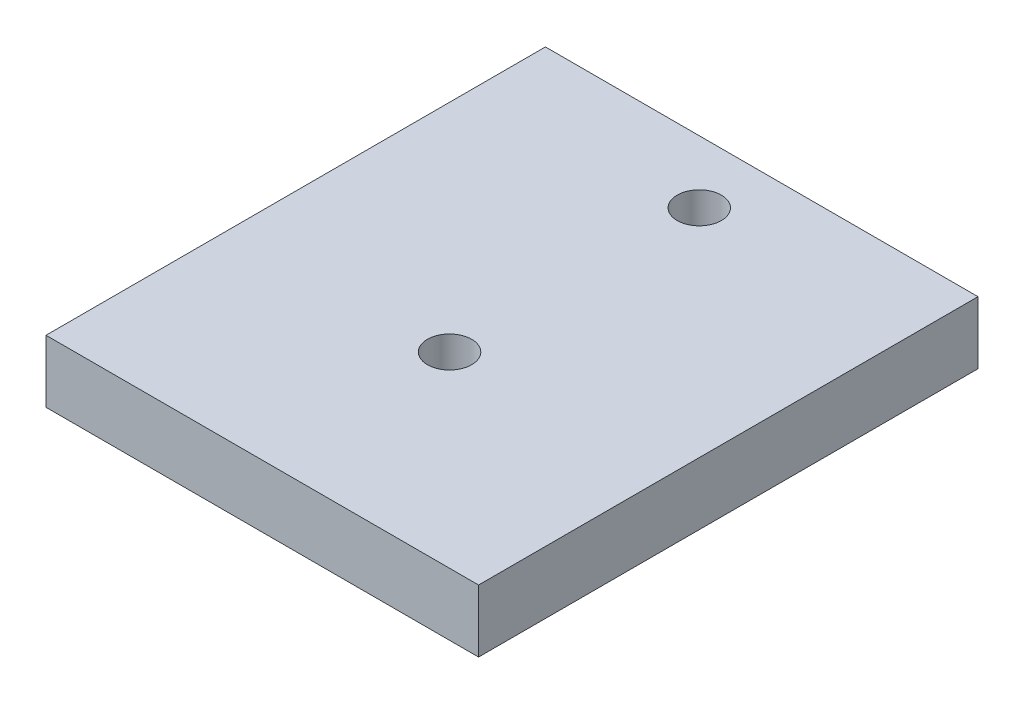
ISO-10303-21;
HEADER;
FILE_DESCRIPTION(('STEP AP214'),'2;1');
FILE_NAME('part.step','',(''),(''),'','','');
FILE_SCHEMA(('AUTOMOTIVE_DESIGN { 1 0 10303 214 1 1 1 1 }'));
ENDSEC;
DATA;
#1=APPLICATION_CONTEXT('core data for automotive mechanical design processes');
#2=APPLICATION_PROTOCOL_DEFINITION('international standard','automotive_design',2000,#1);
#3=PRODUCT_CONTEXT('',#1,'mechanical');
#4=PRODUCT('Part','Part','',(#3));
#5=PRODUCT_RELATED_PRODUCT_CATEGORY('part','',(#4));
#6=PRODUCT_DEFINITION_FORMATION('','',#4);
#7=PRODUCT_DEFINITION_CONTEXT('part definition',#1,'design');
#8=PRODUCT_DEFINITION('design','',#6,#7);
#9=PRODUCT_DEFINITION_SHAPE('','',#8);
#10=(LENGTH_UNIT() NAMED_UNIT(*) SI_UNIT(.MILLI.,.METRE.));
#11=(NAMED_UNIT(*) PLANE_ANGLE_UNIT() SI_UNIT($,.RADIAN.));
#12=(NAMED_UNIT(*) SI_UNIT($,.STERADIAN.) SOLID_ANGLE_UNIT());
#13=UNCERTAINTY_MEASURE_WITH_UNIT(LENGTH_MEASURE(1.E-05),#10,'distance_accuracy_value','');
#14=(GEOMETRIC_REPRESENTATION_CONTEXT(3) GLOBAL_UNCERTAINTY_ASSIGNED_CONTEXT((#13)) GLOBAL_UNIT_ASSIGNED_CONTEXT((#10,
#11,#12)) REPRESENTATION_CONTEXT('',''));
#15=CARTESIAN_POINT('',(0.,0.,0.));
#16=DIRECTION('',(0.,0.,1.));
#17=DIRECTION('',(1.,0.,0.));
#18=AXIS2_PLACEMENT_3D('',#15,#16,#17);
#19=CARTESIAN_POINT('',(22.,6.35,25.4));
#20=DIRECTION('',(-1.,0.,0.));
#21=DIRECTION('',(0.,0.,1.));
#22=AXIS2_PLACEMENT_3D('',#19,#20,#21);
#23=PLANE('',#22);
#24=DIRECTION('',(0.,0.,-1.));
#25=VECTOR('',#24,1.);
#26=CARTESIAN_POINT('',(22.,0.,25.4));
#27=LINE('',#26,#25);
#28=CARTESIAN_POINT('',(22.,0.,25.4));
#29=VERTEX_POINT('',#28);
#30=CARTESIAN_POINT('',(22.,0.,-25.4));
#31=VERTEX_POINT('',#30);
#32=EDGE_CURVE('E113',#29,#31,#27,.T.);
#33=ORIENTED_EDGE('',*,*,#32,.T.);
#34=DIRECTION('',(0.,-1.,0.));
#35=VECTOR('',#34,1.);
#36=CARTESIAN_POINT('',(22.,6.35,-25.4));
#37=LINE('',#36,#35);
#38=CARTESIAN_POINT('',(22.,6.35,-25.4));
#39=VERTEX_POINT('',#38);
#40=EDGE_CURVE('E11',#39,#31,#37,.T.);
#41=ORIENTED_EDGE('',*,*,#40,.F.);
#42=DIRECTION('',(0.,0.,-1.));
#43=VECTOR('',#42,1.);
#44=CARTESIAN_POINT('',(22.,6.35,25.4));
#45=LINE('',#44,#43);
#46=CARTESIAN_POINT('',(22.,6.35,25.4));
#47=VERTEX_POINT('',#46);
#48=EDGE_CURVE('E97',#47,#39,#45,.T.);
#49=ORIENTED_EDGE('',*,*,#48,.F.);
#50=DIRECTION('',(0.,-1.,0.));
#51=VECTOR('',#50,1.);
#52=CARTESIAN_POINT('',(22.,6.35,25.4));
#53=LINE('',#52,#51);
#54=EDGE_CURVE('E109',#47,#29,#53,.T.);
#55=ORIENTED_EDGE('',*,*,#54,.T.);
#56=EDGE_LOOP('',(#33,#41,#49,#55));
#57=FACE_BOUND('',#56,.T.);
#58=ADVANCED_FACE('F45',(#57),#23,.F.);
#59=CARTESIAN_POINT('',(-22.,6.35,-25.4));
#60=DIRECTION('',(0.,0.,1.));
#61=DIRECTION('',(1.,0.,0.));
#62=AXIS2_PLACEMENT_3D('',#59,#60,#61);
#63=PLANE('',#62);
#64=DIRECTION('',(-1.,0.,0.));
#65=VECTOR('',#64,1.);
#66=CARTESIAN_POINT('',(-22.,0.,-25.4));
#67=LINE('',#66,#65);
#68=CARTESIAN_POINT('',(-22.,0.,-25.4));
#69=VERTEX_POINT('',#68);
#70=EDGE_CURVE('E102',#31,#69,#67,.T.);
#71=ORIENTED_EDGE('',*,*,#70,.T.);
#72=DIRECTION('',(0.,-1.,0.));
#73=VECTOR('',#72,1.);
#74=CARTESIAN_POINT('',(-22.,6.35,-25.4));
#75=LINE('',#74,#73);
#76=CARTESIAN_POINT('',(-22.,6.35,-25.4));
#77=VERTEX_POINT('',#76);
#78=EDGE_CURVE('E54',#77,#69,#75,.T.);
#79=ORIENTED_EDGE('',*,*,#78,.F.);
#80=DIRECTION('',(-1.,0.,0.));
#81=VECTOR('',#80,1.);
#82=CARTESIAN_POINT('',(-22.,6.35,-25.4));
#83=LINE('',#82,#81);
#84=EDGE_CURVE('E92',#39,#77,#83,.T.);
#85=ORIENTED_EDGE('',*,*,#84,.F.);
#86=ORIENTED_EDGE('',*,*,#40,.T.);
#87=EDGE_LOOP('',(#71,#79,#85,#86));
#88=FACE_BOUND('',#87,.T.);
#89=ADVANCED_FACE('F101',(#88),#63,.F.);
#90=CARTESIAN_POINT('',(-22.,6.35,25.4));
#91=DIRECTION('',(1.,0.,0.));
#92=DIRECTION('',(0.,0.,-1.));
#93=AXIS2_PLACEMENT_3D('',#90,#91,#92);
#94=PLANE('',#93);
#95=DIRECTION('',(0.,0.,1.));
#96=VECTOR('',#95,1.);
#97=CARTESIAN_POINT('',(-22.,0.,25.4));
#98=LINE('',#97,#96);
#99=CARTESIAN_POINT('',(-22.,0.,25.4));
#100=VERTEX_POINT('',#99);
#101=EDGE_CURVE('E79',#69,#100,#98,.T.);
#102=ORIENTED_EDGE('',*,*,#101,.T.);
#103=DIRECTION('',(0.,-1.,0.));
#104=VECTOR('',#103,1.);
#105=CARTESIAN_POINT('',(-22.,6.35,25.4));
#106=LINE('',#105,#104);
#107=CARTESIAN_POINT('',(-22.,6.35,25.4));
#108=VERTEX_POINT('',#107);
#109=EDGE_CURVE('E104',#108,#100,#106,.T.);
#110=ORIENTED_EDGE('',*,*,#109,.F.);
#111=DIRECTION('',(0.,0.,1.));
#112=VECTOR('',#111,1.);
#113=CARTESIAN_POINT('',(-22.,6.35,25.4));
#114=LINE('',#113,#112);
#115=EDGE_CURVE('E95',#77,#108,#114,.T.);
#116=ORIENTED_EDGE('',*,*,#115,.F.);
#117=ORIENTED_EDGE('',*,*,#78,.T.);
#118=EDGE_LOOP('',(#102,#110,#116,#117));
#119=FACE_BOUND('',#118,.T.);
#120=ADVANCED_FACE('F105',(#119),#94,.F.);
#121=CARTESIAN_POINT('',(-22.,6.35,25.4));
#122=DIRECTION('',(0.,0.,-1.));
#123=DIRECTION('',(-1.,0.,0.));
#124=AXIS2_PLACEMENT_3D('',#121,#122,#123);
#125=PLANE('',#124);
#126=DIRECTION('',(1.,0.,0.));
#127=VECTOR('',#126,1.);
#128=CARTESIAN_POINT('',(-22.,0.,25.4));
#129=LINE('',#128,#127);
#130=EDGE_CURVE('E85',#100,#29,#129,.T.);
#131=ORIENTED_EDGE('',*,*,#130,.T.);
#132=ORIENTED_EDGE('',*,*,#54,.F.);
#133=DIRECTION('',(1.,0.,0.));
#134=VECTOR('',#133,1.);
#135=CARTESIAN_POINT('',(-22.,6.35,25.4));
#136=LINE('',#135,#134);
#137=EDGE_CURVE('E62',#108,#47,#136,.T.);
#138=ORIENTED_EDGE('',*,*,#137,.F.);
#139=ORIENTED_EDGE('',*,*,#109,.T.);
#140=EDGE_LOOP('',(#131,#132,#138,#139));
#141=FACE_BOUND('',#140,.T.);
#142=ADVANCED_FACE('F127',(#141),#125,.F.);
#143=CARTESIAN_POINT('',(0.,6.35,0.));
#144=DIRECTION('',(0.,-1.,0.));
#145=DIRECTION('',(0.,0.,-1.));
#146=AXIS2_PLACEMENT_3D('',#143,#144,#145);
#147=PLANE('',#146);
#148=CARTESIAN_POINT('',(0.,6.35,6.35000000000001));
#149=DIRECTION('',(0.,1.,0.));
#150=DIRECTION('',(0.,0.,1.));
#151=AXIS2_PLACEMENT_3D('',#148,#149,#150);
#152=CIRCLE('',#151,2.2479);
#153=CARTESIAN_POINT('',(0.,6.35,8.59790000000001));
#154=VERTEX_POINT('',#153);
#155=EDGE_CURVE('E142',#154,#154,#152,.T.);
#156=ORIENTED_EDGE('',*,*,#155,.F.);
#157=EDGE_LOOP('',(#156));
#158=FACE_BOUND('',#157,.T.);
#159=CARTESIAN_POINT('',(0.,6.35,-19.05));
#160=DIRECTION('',(0.,1.,0.));
#161=DIRECTION('',(0.,0.,1.));
#162=AXIS2_PLACEMENT_3D('',#159,#160,#161);
#163=CIRCLE('',#162,2.2479);
#164=CARTESIAN_POINT('',(0.,6.35,-16.8021));
#165=VERTEX_POINT('',#164);
#166=EDGE_CURVE('E138',#165,#165,#163,.T.);
#167=ORIENTED_EDGE('',*,*,#166,.F.);
#168=EDGE_LOOP('',(#167));
#169=FACE_BOUND('',#168,.T.);
#170=ORIENTED_EDGE('',*,*,#48,.T.);
#171=ORIENTED_EDGE('',*,*,#84,.T.);
#172=ORIENTED_EDGE('',*,*,#115,.T.);
#173=ORIENTED_EDGE('',*,*,#137,.T.);
#174=EDGE_LOOP('',(#170,#171,#172,#173));
#175=FACE_BOUND('',#174,.T.);
#176=ADVANCED_FACE('F93',(#158,#169,#175),#147,.F.);
#177=CARTESIAN_POINT('',(0.,0.,0.));
#178=DIRECTION('',(0.,-1.,0.));
#179=DIRECTION('',(0.,0.,-1.));
#180=AXIS2_PLACEMENT_3D('',#177,#178,#179);
#181=PLANE('',#180);
#182=CARTESIAN_POINT('',(0.,0.,6.35000000000001));
#183=DIRECTION('',(0.,1.,0.));
#184=DIRECTION('',(0.,0.,1.));
#185=AXIS2_PLACEMENT_3D('',#182,#183,#184);
#186=CIRCLE('',#185,2.2479);
#187=CARTESIAN_POINT('',(0.,0.,8.59790000000001));
#188=VERTEX_POINT('',#187);
#189=EDGE_CURVE('E117',#188,#188,#186,.T.);
#190=ORIENTED_EDGE('',*,*,#189,.T.);
#191=EDGE_LOOP('',(#190));
#192=FACE_BOUND('',#191,.T.);
#193=CARTESIAN_POINT('',(0.,0.,-19.05));
#194=DIRECTION('',(0.,1.,0.));
#195=DIRECTION('',(0.,0.,1.));
#196=AXIS2_PLACEMENT_3D('',#193,#194,#195);
#197=CIRCLE('',#196,2.2479);
#198=CARTESIAN_POINT('',(0.,0.,-16.8021));
#199=VERTEX_POINT('',#198);
#200=EDGE_CURVE('E134',#199,#199,#197,.T.);
#201=ORIENTED_EDGE('',*,*,#200,.T.);
#202=EDGE_LOOP('',(#201));
#203=FACE_BOUND('',#202,.T.);
#204=ORIENTED_EDGE('',*,*,#32,.F.);
#205=ORIENTED_EDGE('',*,*,#130,.F.);
#206=ORIENTED_EDGE('',*,*,#101,.F.);
#207=ORIENTED_EDGE('',*,*,#70,.F.);
#208=EDGE_LOOP('',(#204,#205,#206,#207));
#209=FACE_BOUND('',#208,.T.);
#210=ADVANCED_FACE('F130',(#192,#203,#209),#181,.T.);
#211=CARTESIAN_POINT('',(0.,0.,-19.05));
#212=DIRECTION('',(0.,1.,0.));
#213=DIRECTION('',(0.,0.,1.));
#214=AXIS2_PLACEMENT_3D('',#211,#212,#213);
#215=CYLINDRICAL_SURFACE('',#214,2.2479);
#216=ORIENTED_EDGE('',*,*,#200,.F.);
#217=EDGE_LOOP('',(#216));
#218=FACE_BOUND('',#217,.T.);
#219=ORIENTED_EDGE('',*,*,#166,.T.);
#220=EDGE_LOOP('',(#219));
#221=FACE_BOUND('',#220,.T.);
#222=ADVANCED_FACE('F155',(#218,#221),#215,.F.);
#223=CARTESIAN_POINT('',(0.,0.,6.35000000000001));
#224=DIRECTION('',(0.,1.,0.));
#225=DIRECTION('',(0.,0.,1.));
#226=AXIS2_PLACEMENT_3D('',#223,#224,#225);
#227=CYLINDRICAL_SURFACE('',#226,2.2479);
#228=ORIENTED_EDGE('',*,*,#189,.F.);
#229=EDGE_LOOP('',(#228));
#230=FACE_BOUND('',#229,.T.);
#231=ORIENTED_EDGE('',*,*,#155,.T.);
#232=EDGE_LOOP('',(#231));
#233=FACE_BOUND('',#232,.T.);
#234=ADVANCED_FACE('F152',(#230,#233),#227,.F.);
#235=CLOSED_SHELL('',(#58,#89,#120,#142,#176,#210,#222,#234));
#236=MANIFOLD_SOLID_BREP('B2',#235);
#237=ADVANCED_BREP_SHAPE_REPRESENTATION('',(#18,#236),#14);
#238=SHAPE_DEFINITION_REPRESENTATION(#9,#237);
ENDSEC;
END-ISO-10303-21;
